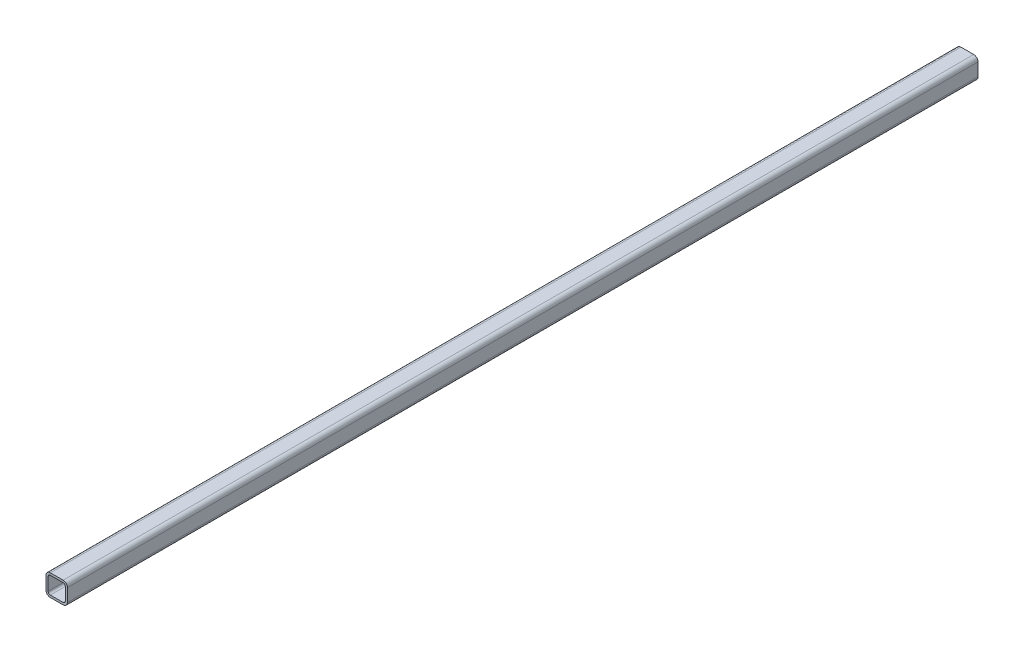
ISO-10303-21;
HEADER;
FILE_DESCRIPTION(('STEP AP214'),'2;1');
FILE_NAME('part.step','',(''),(''),'','','');
FILE_SCHEMA(('AUTOMOTIVE_DESIGN { 1 0 10303 214 1 1 1 1 }'));
ENDSEC;
DATA;
#1=APPLICATION_CONTEXT('core data for automotive mechanical design processes');
#2=APPLICATION_PROTOCOL_DEFINITION('international standard','automotive_design',2000,#1);
#3=PRODUCT_CONTEXT('',#1,'mechanical');
#4=PRODUCT('Part','Part','',(#3));
#5=PRODUCT_RELATED_PRODUCT_CATEGORY('part','',(#4));
#6=PRODUCT_DEFINITION_FORMATION('','',#4);
#7=PRODUCT_DEFINITION_CONTEXT('part definition',#1,'design');
#8=PRODUCT_DEFINITION('design','',#6,#7);
#9=PRODUCT_DEFINITION_SHAPE('','',#8);
#10=(LENGTH_UNIT() NAMED_UNIT(*) SI_UNIT(.MILLI.,.METRE.));
#11=(NAMED_UNIT(*) PLANE_ANGLE_UNIT() SI_UNIT($,.RADIAN.));
#12=(NAMED_UNIT(*) SI_UNIT($,.STERADIAN.) SOLID_ANGLE_UNIT());
#13=UNCERTAINTY_MEASURE_WITH_UNIT(LENGTH_MEASURE(1.E-05),#10,'distance_accuracy_value','');
#14=(GEOMETRIC_REPRESENTATION_CONTEXT(3) GLOBAL_UNCERTAINTY_ASSIGNED_CONTEXT((#13)) GLOBAL_UNIT_ASSIGNED_CONTEXT((#10,
#11,#12)) REPRESENTATION_CONTEXT('',''));
#15=CARTESIAN_POINT('',(0.,0.,0.));
#16=DIRECTION('',(0.,0.,1.));
#17=DIRECTION('',(1.,0.,0.));
#18=AXIS2_PLACEMENT_3D('',#15,#16,#17);
#19=CARTESIAN_POINT('',(11.9999999999998,12.,850.011));
#20=DIRECTION('',(0.,0.,-1.));
#21=DIRECTION('',(-1.,0.,0.));
#22=AXIS2_PLACEMENT_3D('',#19,#20,#21);
#23=CYLINDRICAL_SURFACE('',#22,8.);
#24=CARTESIAN_POINT('',(11.9999999999998,12.,-850.011));
#25=DIRECTION('',(0.,0.,1.));
#26=DIRECTION('',(1.,0.,0.));
#27=AXIS2_PLACEMENT_3D('',#24,#25,#26);
#28=CIRCLE('',#27,8.);
#29=CARTESIAN_POINT('',(19.9999999999998,12.,-850.011));
#30=VERTEX_POINT('',#29);
#31=CARTESIAN_POINT('',(11.9999999999998,20.,-850.011));
#32=VERTEX_POINT('',#31);
#33=EDGE_CURVE('E289',#30,#32,#28,.T.);
#34=ORIENTED_EDGE('',*,*,#33,.T.);
#35=DIRECTION('',(0.,0.,-1.));
#36=VECTOR('',#35,1.);
#37=CARTESIAN_POINT('',(11.9999999999998,20.,850.011));
#38=LINE('',#37,#36);
#39=CARTESIAN_POINT('',(11.9999999999998,20.,850.011));
#40=VERTEX_POINT('',#39);
#41=EDGE_CURVE('E12',#40,#32,#38,.T.);
#42=ORIENTED_EDGE('',*,*,#41,.F.);
#43=CARTESIAN_POINT('',(11.9999999999998,12.,850.011));
#44=DIRECTION('',(0.,0.,1.));
#45=DIRECTION('',(1.,0.,0.));
#46=AXIS2_PLACEMENT_3D('',#43,#44,#45);
#47=CIRCLE('',#46,8.);
#48=CARTESIAN_POINT('',(19.9999999999998,12.,850.011));
#49=VERTEX_POINT('',#48);
#50=EDGE_CURVE('E394',#49,#40,#47,.T.);
#51=ORIENTED_EDGE('',*,*,#50,.F.);
#52=DIRECTION('',(0.,0.,-1.));
#53=VECTOR('',#52,1.);
#54=CARTESIAN_POINT('',(19.9999999999998,12.,850.011));
#55=LINE('',#54,#53);
#56=EDGE_CURVE('E312',#49,#30,#55,.T.);
#57=ORIENTED_EDGE('',*,*,#56,.T.);
#58=EDGE_LOOP('',(#34,#42,#51,#57));
#59=FACE_BOUND('',#58,.T.);
#60=ADVANCED_FACE('F71',(#59),#23,.T.);
#61=CARTESIAN_POINT('',(11.9999999999998,20.,850.011));
#62=DIRECTION('',(0.,-1.,0.));
#63=DIRECTION('',(0.,0.,-1.));
#64=AXIS2_PLACEMENT_3D('',#61,#62,#63);
#65=PLANE('',#64);
#66=DIRECTION('',(-1.,0.,0.));
#67=VECTOR('',#66,1.);
#68=CARTESIAN_POINT('',(11.9999999999998,20.,-850.011));
#69=LINE('',#68,#67);
#70=CARTESIAN_POINT('',(-12.0000000000002,20.,-850.011));
#71=VERTEX_POINT('',#70);
#72=EDGE_CURVE('E293',#32,#71,#69,.T.);
#73=ORIENTED_EDGE('',*,*,#72,.T.);
#74=DIRECTION('',(0.,0.,-1.));
#75=VECTOR('',#74,1.);
#76=CARTESIAN_POINT('',(-12.0000000000002,20.,850.011));
#77=LINE('',#76,#75);
#78=CARTESIAN_POINT('',(-12.0000000000002,20.,850.011));
#79=VERTEX_POINT('',#78);
#80=EDGE_CURVE('E82',#79,#71,#77,.T.);
#81=ORIENTED_EDGE('',*,*,#80,.F.);
#82=DIRECTION('',(-1.,0.,0.));
#83=VECTOR('',#82,1.);
#84=CARTESIAN_POINT('',(11.9999999999998,20.,850.011));
#85=LINE('',#84,#83);
#86=EDGE_CURVE('E397',#40,#79,#85,.T.);
#87=ORIENTED_EDGE('',*,*,#86,.F.);
#88=ORIENTED_EDGE('',*,*,#41,.T.);
#89=EDGE_LOOP('',(#73,#81,#87,#88));
#90=FACE_BOUND('',#89,.T.);
#91=ADVANCED_FACE('F432',(#90),#65,.F.);
#92=CARTESIAN_POINT('',(-12.0000000000002,12.,850.011));
#93=DIRECTION('',(0.,0.,-1.));
#94=DIRECTION('',(-1.,0.,0.));
#95=AXIS2_PLACEMENT_3D('',#92,#93,#94);
#96=CYLINDRICAL_SURFACE('',#95,8.);
#97=CARTESIAN_POINT('',(-12.0000000000002,12.,-850.011));
#98=DIRECTION('',(0.,0.,1.));
#99=DIRECTION('',(1.,0.,0.));
#100=AXIS2_PLACEMENT_3D('',#97,#98,#99);
#101=CIRCLE('',#100,8.);
#102=CARTESIAN_POINT('',(-20.0000000000002,12.,-850.011));
#103=VERTEX_POINT('',#102);
#104=EDGE_CURVE('E296',#71,#103,#101,.T.);
#105=ORIENTED_EDGE('',*,*,#104,.T.);
#106=DIRECTION('',(0.,0.,-1.));
#107=VECTOR('',#106,1.);
#108=CARTESIAN_POINT('',(-20.0000000000002,12.,850.011));
#109=LINE('',#108,#107);
#110=CARTESIAN_POINT('',(-20.0000000000002,12.,850.011));
#111=VERTEX_POINT('',#110);
#112=EDGE_CURVE('E323',#111,#103,#109,.T.);
#113=ORIENTED_EDGE('',*,*,#112,.F.);
#114=CARTESIAN_POINT('',(-12.0000000000002,12.,850.011));
#115=DIRECTION('',(0.,0.,1.));
#116=DIRECTION('',(1.,0.,0.));
#117=AXIS2_PLACEMENT_3D('',#114,#115,#116);
#118=CIRCLE('',#117,8.);
#119=EDGE_CURVE('E400',#79,#111,#118,.T.);
#120=ORIENTED_EDGE('',*,*,#119,.F.);
#121=ORIENTED_EDGE('',*,*,#80,.T.);
#122=EDGE_LOOP('',(#105,#113,#120,#121));
#123=FACE_BOUND('',#122,.T.);
#124=ADVANCED_FACE('F438',(#123),#96,.T.);
#125=CARTESIAN_POINT('',(-20.0000000000002,-12.,850.011));
#126=DIRECTION('',(1.,0.,0.));
#127=DIRECTION('',(0.,0.,-1.));
#128=AXIS2_PLACEMENT_3D('',#125,#126,#127);
#129=PLANE('',#128);
#130=DIRECTION('',(0.,-1.,0.));
#131=VECTOR('',#130,1.);
#132=CARTESIAN_POINT('',(-20.0000000000002,-12.,-850.011));
#133=LINE('',#132,#131);
#134=CARTESIAN_POINT('',(-20.0000000000002,-12.,-850.011));
#135=VERTEX_POINT('',#134);
#136=EDGE_CURVE('E299',#103,#135,#133,.T.);
#137=ORIENTED_EDGE('',*,*,#136,.T.);
#138=DIRECTION('',(0.,0.,-1.));
#139=VECTOR('',#138,1.);
#140=CARTESIAN_POINT('',(-20.0000000000002,-12.,850.011));
#141=LINE('',#140,#139);
#142=CARTESIAN_POINT('',(-20.0000000000002,-12.,850.011));
#143=VERTEX_POINT('',#142);
#144=EDGE_CURVE('E319',#143,#135,#141,.T.);
#145=ORIENTED_EDGE('',*,*,#144,.F.);
#146=DIRECTION('',(0.,-1.,0.));
#147=VECTOR('',#146,1.);
#148=CARTESIAN_POINT('',(-20.0000000000002,-12.,850.011));
#149=LINE('',#148,#147);
#150=EDGE_CURVE('E403',#111,#143,#149,.T.);
#151=ORIENTED_EDGE('',*,*,#150,.F.);
#152=ORIENTED_EDGE('',*,*,#112,.T.);
#153=EDGE_LOOP('',(#137,#145,#151,#152));
#154=FACE_BOUND('',#153,.T.);
#155=ADVANCED_FACE('F587',(#154),#129,.F.);
#156=CARTESIAN_POINT('',(-12.0000000000002,-12.,850.011));
#157=DIRECTION('',(0.,0.,-1.));
#158=DIRECTION('',(-1.,0.,0.));
#159=AXIS2_PLACEMENT_3D('',#156,#157,#158);
#160=CYLINDRICAL_SURFACE('',#159,8.);
#161=CARTESIAN_POINT('',(-12.0000000000002,-12.,-850.011));
#162=DIRECTION('',(0.,0.,1.));
#163=DIRECTION('',(1.,0.,0.));
#164=AXIS2_PLACEMENT_3D('',#161,#162,#163);
#165=CIRCLE('',#164,8.);
#166=CARTESIAN_POINT('',(-12.0000000000002,-20.,-850.011));
#167=VERTEX_POINT('',#166);
#168=EDGE_CURVE('E302',#135,#167,#165,.T.);
#169=ORIENTED_EDGE('',*,*,#168,.T.);
#170=DIRECTION('',(0.,0.,-1.));
#171=VECTOR('',#170,1.);
#172=CARTESIAN_POINT('',(-12.0000000000002,-20.,850.011));
#173=LINE('',#172,#171);
#174=CARTESIAN_POINT('',(-12.0000000000002,-20.,850.011));
#175=VERTEX_POINT('',#174);
#176=EDGE_CURVE('E245',#175,#167,#173,.T.);
#177=ORIENTED_EDGE('',*,*,#176,.F.);
#178=CARTESIAN_POINT('',(-12.0000000000002,-12.,850.011));
#179=DIRECTION('',(0.,0.,1.));
#180=DIRECTION('',(1.,0.,0.));
#181=AXIS2_PLACEMENT_3D('',#178,#179,#180);
#182=CIRCLE('',#181,8.);
#183=EDGE_CURVE('E234',#143,#175,#182,.T.);
#184=ORIENTED_EDGE('',*,*,#183,.F.);
#185=ORIENTED_EDGE('',*,*,#144,.T.);
#186=EDGE_LOOP('',(#169,#177,#184,#185));
#187=FACE_BOUND('',#186,.T.);
#188=ADVANCED_FACE('F575',(#187),#160,.T.);
#189=CARTESIAN_POINT('',(-12.0000000000002,-20.,850.011));
#190=DIRECTION('',(0.,1.,0.));
#191=DIRECTION('',(0.,0.,1.));
#192=AXIS2_PLACEMENT_3D('',#189,#190,#191);
#193=PLANE('',#192);
#194=DIRECTION('',(1.,0.,0.));
#195=VECTOR('',#194,1.);
#196=CARTESIAN_POINT('',(-12.0000000000002,-20.,-850.011));
#197=LINE('',#196,#195);
#198=CARTESIAN_POINT('',(11.9999999999998,-20.,-850.011));
#199=VERTEX_POINT('',#198);
#200=EDGE_CURVE('E243',#167,#199,#197,.T.);
#201=ORIENTED_EDGE('',*,*,#200,.T.);
#202=DIRECTION('',(0.,0.,-1.));
#203=VECTOR('',#202,1.);
#204=CARTESIAN_POINT('',(11.9999999999998,-20.,850.011));
#205=LINE('',#204,#203);
#206=CARTESIAN_POINT('',(11.9999999999998,-20.,850.011));
#207=VERTEX_POINT('',#206);
#208=EDGE_CURVE('E240',#207,#199,#205,.T.);
#209=ORIENTED_EDGE('',*,*,#208,.F.);
#210=DIRECTION('',(1.,0.,0.));
#211=VECTOR('',#210,1.);
#212=CARTESIAN_POINT('',(-12.0000000000002,-20.,850.011));
#213=LINE('',#212,#211);
#214=EDGE_CURVE('E228',#175,#207,#213,.T.);
#215=ORIENTED_EDGE('',*,*,#214,.F.);
#216=ORIENTED_EDGE('',*,*,#176,.T.);
#217=EDGE_LOOP('',(#201,#209,#215,#216));
#218=FACE_BOUND('',#217,.T.);
#219=ADVANCED_FACE('F241',(#218),#193,.F.);
#220=CARTESIAN_POINT('',(11.9999999999998,-12.,850.011));
#221=DIRECTION('',(0.,0.,-1.));
#222=DIRECTION('',(-1.,0.,0.));
#223=AXIS2_PLACEMENT_3D('',#220,#221,#222);
#224=CYLINDRICAL_SURFACE('',#223,8.);
#225=CARTESIAN_POINT('',(11.9999999999998,-12.,-850.011));
#226=DIRECTION('',(0.,0.,1.));
#227=DIRECTION('',(1.,0.,0.));
#228=AXIS2_PLACEMENT_3D('',#225,#226,#227);
#229=CIRCLE('',#228,8.);
#230=CARTESIAN_POINT('',(19.9999999999998,-12.,-850.011));
#231=VERTEX_POINT('',#230);
#232=EDGE_CURVE('E163',#199,#231,#229,.T.);
#233=ORIENTED_EDGE('',*,*,#232,.T.);
#234=DIRECTION('',(0.,0.,-1.));
#235=VECTOR('',#234,1.);
#236=CARTESIAN_POINT('',(19.9999999999998,-12.,850.011));
#237=LINE('',#236,#235);
#238=CARTESIAN_POINT('',(19.9999999999998,-12.,850.011));
#239=VERTEX_POINT('',#238);
#240=EDGE_CURVE('E246',#239,#231,#237,.T.);
#241=ORIENTED_EDGE('',*,*,#240,.F.);
#242=CARTESIAN_POINT('',(11.9999999999998,-12.,850.011));
#243=DIRECTION('',(0.,0.,1.));
#244=DIRECTION('',(1.,0.,0.));
#245=AXIS2_PLACEMENT_3D('',#242,#243,#244);
#246=CIRCLE('',#245,8.);
#247=EDGE_CURVE('E232',#207,#239,#246,.T.);
#248=ORIENTED_EDGE('',*,*,#247,.F.);
#249=ORIENTED_EDGE('',*,*,#208,.T.);
#250=EDGE_LOOP('',(#233,#241,#248,#249));
#251=FACE_BOUND('',#250,.T.);
#252=ADVANCED_FACE('F248',(#251),#224,.T.);
#253=CARTESIAN_POINT('',(-12.0000000000002,12.,850.011));
#254=DIRECTION('',(0.,0.,-1.));
#255=DIRECTION('',(-1.,0.,0.));
#256=AXIS2_PLACEMENT_3D('',#253,#254,#255);
#257=CYLINDRICAL_SURFACE('',#256,4.);
#258=CARTESIAN_POINT('',(-12.0000000000002,12.,-850.011));
#259=DIRECTION('',(0.,0.,1.));
#260=DIRECTION('',(1.,0.,0.));
#261=AXIS2_PLACEMENT_3D('',#258,#259,#260);
#262=CIRCLE('',#261,4.);
#263=CARTESIAN_POINT('',(-12.0000000000002,16.,-850.011));
#264=VERTEX_POINT('',#263);
#265=CARTESIAN_POINT('',(-16.0000000000002,12.,-850.011));
#266=VERTEX_POINT('',#265);
#267=EDGE_CURVE('E257',#264,#266,#262,.T.);
#268=ORIENTED_EDGE('',*,*,#267,.F.);
#269=DIRECTION('',(0.,0.,-1.));
#270=VECTOR('',#269,1.);
#271=CARTESIAN_POINT('',(-12.0000000000002,16.,850.011));
#272=LINE('',#271,#270);
#273=CARTESIAN_POINT('',(-12.0000000000002,16.,850.011));
#274=VERTEX_POINT('',#273);
#275=EDGE_CURVE('E75',#274,#264,#272,.T.);
#276=ORIENTED_EDGE('',*,*,#275,.F.);
#277=CARTESIAN_POINT('',(-12.0000000000002,12.,850.011));
#278=DIRECTION('',(0.,0.,1.));
#279=DIRECTION('',(1.,0.,0.));
#280=AXIS2_PLACEMENT_3D('',#277,#278,#279);
#281=CIRCLE('',#280,4.);
#282=CARTESIAN_POINT('',(-16.0000000000002,12.,850.011));
#283=VERTEX_POINT('',#282);
#284=EDGE_CURVE('E311',#274,#283,#281,.T.);
#285=ORIENTED_EDGE('',*,*,#284,.T.);
#286=DIRECTION('',(0.,0.,-1.));
#287=VECTOR('',#286,1.);
#288=CARTESIAN_POINT('',(-16.0000000000002,12.,850.011));
#289=LINE('',#288,#287);
#290=EDGE_CURVE('E253',#283,#266,#289,.T.);
#291=ORIENTED_EDGE('',*,*,#290,.T.);
#292=EDGE_LOOP('',(#268,#276,#285,#291));
#293=FACE_BOUND('',#292,.T.);
#294=ADVANCED_FACE('F73',(#293),#257,.F.);
#295=CARTESIAN_POINT('',(11.9999999999998,16.,850.011));
#296=DIRECTION('',(0.,-1.,0.));
#297=DIRECTION('',(0.,0.,-1.));
#298=AXIS2_PLACEMENT_3D('',#295,#296,#297);
#299=PLANE('',#298);
#300=DIRECTION('',(-1.,0.,0.));
#301=VECTOR('',#300,1.);
#302=CARTESIAN_POINT('',(11.9999999999998,16.,-850.011));
#303=LINE('',#302,#301);
#304=CARTESIAN_POINT('',(11.9999999999998,16.,-850.011));
#305=VERTEX_POINT('',#304);
#306=EDGE_CURVE('E261',#305,#264,#303,.T.);
#307=ORIENTED_EDGE('',*,*,#306,.F.);
#308=DIRECTION('',(0.,0.,-1.));
#309=VECTOR('',#308,1.);
#310=CARTESIAN_POINT('',(11.9999999999998,16.,850.011));
#311=LINE('',#310,#309);
#312=CARTESIAN_POINT('',(11.9999999999998,16.,850.011));
#313=VERTEX_POINT('',#312);
#314=EDGE_CURVE('E346',#313,#305,#311,.T.);
#315=ORIENTED_EDGE('',*,*,#314,.F.);
#316=DIRECTION('',(-1.,0.,0.));
#317=VECTOR('',#316,1.);
#318=CARTESIAN_POINT('',(11.9999999999998,16.,850.011));
#319=LINE('',#318,#317);
#320=EDGE_CURVE('E357',#313,#274,#319,.T.);
#321=ORIENTED_EDGE('',*,*,#320,.T.);
#322=ORIENTED_EDGE('',*,*,#275,.T.);
#323=EDGE_LOOP('',(#307,#315,#321,#322));
#324=FACE_BOUND('',#323,.T.);
#325=ADVANCED_FACE('F355',(#324),#299,.T.);
#326=CARTESIAN_POINT('',(11.9999999999998,12.,850.011));
#327=DIRECTION('',(0.,0.,-1.));
#328=DIRECTION('',(-1.,0.,0.));
#329=AXIS2_PLACEMENT_3D('',#326,#327,#328);
#330=CYLINDRICAL_SURFACE('',#329,4.);
#331=CARTESIAN_POINT('',(11.9999999999998,12.,-850.011));
#332=DIRECTION('',(0.,0.,1.));
#333=DIRECTION('',(1.,0.,0.));
#334=AXIS2_PLACEMENT_3D('',#331,#332,#333);
#335=CIRCLE('',#334,4.);
#336=CARTESIAN_POINT('',(15.9999999999998,12.,-850.011));
#337=VERTEX_POINT('',#336);
#338=EDGE_CURVE('E265',#337,#305,#335,.T.);
#339=ORIENTED_EDGE('',*,*,#338,.F.);
#340=DIRECTION('',(0.,0.,-1.));
#341=VECTOR('',#340,1.);
#342=CARTESIAN_POINT('',(15.9999999999998,12.,850.011));
#343=LINE('',#342,#341);
#344=CARTESIAN_POINT('',(15.9999999999998,12.,850.011));
#345=VERTEX_POINT('',#344);
#346=EDGE_CURVE('E344',#345,#337,#343,.T.);
#347=ORIENTED_EDGE('',*,*,#346,.F.);
#348=CARTESIAN_POINT('',(11.9999999999998,12.,850.011));
#349=DIRECTION('',(0.,0.,1.));
#350=DIRECTION('',(1.,0.,0.));
#351=AXIS2_PLACEMENT_3D('',#348,#349,#350);
#352=CIRCLE('',#351,4.);
#353=EDGE_CURVE('E365',#345,#313,#352,.T.);
#354=ORIENTED_EDGE('',*,*,#353,.T.);
#355=ORIENTED_EDGE('',*,*,#314,.T.);
#356=EDGE_LOOP('',(#339,#347,#354,#355));
#357=FACE_BOUND('',#356,.T.);
#358=ADVANCED_FACE('F363',(#357),#330,.F.);
#359=CARTESIAN_POINT('',(15.9999999999998,12.,850.011));
#360=DIRECTION('',(-1.,0.,0.));
#361=DIRECTION('',(0.,0.,1.));
#362=AXIS2_PLACEMENT_3D('',#359,#360,#361);
#363=PLANE('',#362);
#364=DIRECTION('',(0.,1.,0.));
#365=VECTOR('',#364,1.);
#366=CARTESIAN_POINT('',(15.9999999999998,12.,-850.011));
#367=LINE('',#366,#365);
#368=CARTESIAN_POINT('',(15.9999999999998,-12.,-850.011));
#369=VERTEX_POINT('',#368);
#370=EDGE_CURVE('E269',#369,#337,#367,.T.);
#371=ORIENTED_EDGE('',*,*,#370,.F.);
#372=DIRECTION('',(0.,0.,-1.));
#373=VECTOR('',#372,1.);
#374=CARTESIAN_POINT('',(15.9999999999998,-12.,850.011));
#375=LINE('',#374,#373);
#376=CARTESIAN_POINT('',(15.9999999999998,-12.,850.011));
#377=VERTEX_POINT('',#376);
#378=EDGE_CURVE('E341',#377,#369,#375,.T.);
#379=ORIENTED_EDGE('',*,*,#378,.F.);
#380=DIRECTION('',(0.,1.,0.));
#381=VECTOR('',#380,1.);
#382=CARTESIAN_POINT('',(15.9999999999998,12.,850.011));
#383=LINE('',#382,#381);
#384=EDGE_CURVE('E371',#377,#345,#383,.T.);
#385=ORIENTED_EDGE('',*,*,#384,.T.);
#386=ORIENTED_EDGE('',*,*,#346,.T.);
#387=EDGE_LOOP('',(#371,#379,#385,#386));
#388=FACE_BOUND('',#387,.T.);
#389=ADVANCED_FACE('F375',(#388),#363,.T.);
#390=CARTESIAN_POINT('',(11.9999999999998,-12.,850.011));
#391=DIRECTION('',(0.,0.,-1.));
#392=DIRECTION('',(-1.,0.,0.));
#393=AXIS2_PLACEMENT_3D('',#390,#391,#392);
#394=CYLINDRICAL_SURFACE('',#393,3.99999999999999);
#395=CARTESIAN_POINT('',(11.9999999999998,-12.,-850.011));
#396=DIRECTION('',(0.,0.,1.));
#397=DIRECTION('',(1.,0.,0.));
#398=AXIS2_PLACEMENT_3D('',#395,#396,#397);
#399=CIRCLE('',#398,3.99999999999999);
#400=CARTESIAN_POINT('',(11.9999999999998,-16.,-850.011));
#401=VERTEX_POINT('',#400);
#402=EDGE_CURVE('E273',#401,#369,#399,.T.);
#403=ORIENTED_EDGE('',*,*,#402,.F.);
#404=DIRECTION('',(0.,0.,-1.));
#405=VECTOR('',#404,1.);
#406=CARTESIAN_POINT('',(11.9999999999998,-16.,850.011));
#407=LINE('',#406,#405);
#408=CARTESIAN_POINT('',(11.9999999999998,-16.,850.011));
#409=VERTEX_POINT('',#408);
#410=EDGE_CURVE('E338',#409,#401,#407,.T.);
#411=ORIENTED_EDGE('',*,*,#410,.F.);
#412=CARTESIAN_POINT('',(11.9999999999998,-12.,850.011));
#413=DIRECTION('',(0.,0.,1.));
#414=DIRECTION('',(1.,0.,0.));
#415=AXIS2_PLACEMENT_3D('',#412,#413,#414);
#416=CIRCLE('',#415,3.99999999999999);
#417=EDGE_CURVE('E377',#409,#377,#416,.T.);
#418=ORIENTED_EDGE('',*,*,#417,.T.);
#419=ORIENTED_EDGE('',*,*,#378,.T.);
#420=EDGE_LOOP('',(#403,#411,#418,#419));
#421=FACE_BOUND('',#420,.T.);
#422=ADVANCED_FACE('F422',(#421),#394,.F.);
#423=CARTESIAN_POINT('',(-12.0000000000002,-16.,850.011));
#424=DIRECTION('',(0.,1.,0.));
#425=DIRECTION('',(0.,0.,1.));
#426=AXIS2_PLACEMENT_3D('',#423,#424,#425);
#427=PLANE('',#426);
#428=DIRECTION('',(1.,0.,0.));
#429=VECTOR('',#428,1.);
#430=CARTESIAN_POINT('',(-12.0000000000002,-16.,-850.011));
#431=LINE('',#430,#429);
#432=CARTESIAN_POINT('',(-12.0000000000002,-16.,-850.011));
#433=VERTEX_POINT('',#432);
#434=EDGE_CURVE('E277',#433,#401,#431,.T.);
#435=ORIENTED_EDGE('',*,*,#434,.F.);
#436=DIRECTION('',(0.,0.,-1.));
#437=VECTOR('',#436,1.);
#438=CARTESIAN_POINT('',(-12.0000000000002,-16.,850.011));
#439=LINE('',#438,#437);
#440=CARTESIAN_POINT('',(-12.0000000000002,-16.,850.011));
#441=VERTEX_POINT('',#440);
#442=EDGE_CURVE('E335',#441,#433,#439,.T.);
#443=ORIENTED_EDGE('',*,*,#442,.F.);
#444=DIRECTION('',(1.,0.,0.));
#445=VECTOR('',#444,1.);
#446=CARTESIAN_POINT('',(-12.0000000000002,-16.,850.011));
#447=LINE('',#446,#445);
#448=EDGE_CURVE('E380',#441,#409,#447,.T.);
#449=ORIENTED_EDGE('',*,*,#448,.T.);
#450=ORIENTED_EDGE('',*,*,#410,.T.);
#451=EDGE_LOOP('',(#435,#443,#449,#450));
#452=FACE_BOUND('',#451,.T.);
#453=ADVANCED_FACE('F419',(#452),#427,.T.);
#454=CARTESIAN_POINT('',(-12.0000000000002,-12.,850.011));
#455=DIRECTION('',(0.,0.,-1.));
#456=DIRECTION('',(-1.,0.,0.));
#457=AXIS2_PLACEMENT_3D('',#454,#455,#456);
#458=CYLINDRICAL_SURFACE('',#457,4.);
#459=CARTESIAN_POINT('',(-12.0000000000002,-12.,-850.011));
#460=DIRECTION('',(0.,0.,1.));
#461=DIRECTION('',(1.,0.,0.));
#462=AXIS2_PLACEMENT_3D('',#459,#460,#461);
#463=CIRCLE('',#462,4.);
#464=CARTESIAN_POINT('',(-16.0000000000002,-12.,-850.011));
#465=VERTEX_POINT('',#464);
#466=EDGE_CURVE('E281',#465,#433,#463,.T.);
#467=ORIENTED_EDGE('',*,*,#466,.F.);
#468=DIRECTION('',(0.,0.,-1.));
#469=VECTOR('',#468,1.);
#470=CARTESIAN_POINT('',(-16.0000000000002,-12.,850.011));
#471=LINE('',#470,#469);
#472=CARTESIAN_POINT('',(-16.0000000000002,-12.,850.011));
#473=VERTEX_POINT('',#472);
#474=EDGE_CURVE('E332',#473,#465,#471,.T.);
#475=ORIENTED_EDGE('',*,*,#474,.F.);
#476=CARTESIAN_POINT('',(-12.0000000000002,-12.,850.011));
#477=DIRECTION('',(0.,0.,1.));
#478=DIRECTION('',(1.,0.,0.));
#479=AXIS2_PLACEMENT_3D('',#476,#477,#478);
#480=CIRCLE('',#479,4.);
#481=EDGE_CURVE('E386',#473,#441,#480,.T.);
#482=ORIENTED_EDGE('',*,*,#481,.T.);
#483=ORIENTED_EDGE('',*,*,#442,.T.);
#484=EDGE_LOOP('',(#467,#475,#482,#483));
#485=FACE_BOUND('',#484,.T.);
#486=ADVANCED_FACE('F417',(#485),#458,.F.);
#487=CARTESIAN_POINT('',(-16.0000000000002,-12.,850.011));
#488=DIRECTION('',(1.,0.,0.));
#489=DIRECTION('',(0.,0.,-1.));
#490=AXIS2_PLACEMENT_3D('',#487,#488,#489);
#491=PLANE('',#490);
#492=DIRECTION('',(0.,-1.,0.));
#493=VECTOR('',#492,1.);
#494=CARTESIAN_POINT('',(-16.0000000000002,-12.,-850.011));
#495=LINE('',#494,#493);
#496=EDGE_CURVE('E285',#266,#465,#495,.T.);
#497=ORIENTED_EDGE('',*,*,#496,.F.);
#498=ORIENTED_EDGE('',*,*,#290,.F.);
#499=DIRECTION('',(0.,-1.,0.));
#500=VECTOR('',#499,1.);
#501=CARTESIAN_POINT('',(-16.0000000000002,-12.,850.011));
#502=LINE('',#501,#500);
#503=EDGE_CURVE('E390',#283,#473,#502,.T.);
#504=ORIENTED_EDGE('',*,*,#503,.T.);
#505=ORIENTED_EDGE('',*,*,#474,.T.);
#506=EDGE_LOOP('',(#497,#498,#504,#505));
#507=FACE_BOUND('',#506,.T.);
#508=ADVANCED_FACE('F413',(#507),#491,.T.);
#509=CARTESIAN_POINT('',(19.9999999999998,12.,850.011));
#510=DIRECTION('',(-1.,0.,0.));
#511=DIRECTION('',(0.,0.,1.));
#512=AXIS2_PLACEMENT_3D('',#509,#510,#511);
#513=PLANE('',#512);
#514=DIRECTION('',(0.,1.,0.));
#515=VECTOR('',#514,1.);
#516=CARTESIAN_POINT('',(19.9999999999998,12.,-850.011));
#517=LINE('',#516,#515);
#518=EDGE_CURVE('E170',#231,#30,#517,.T.);
#519=ORIENTED_EDGE('',*,*,#518,.T.);
#520=ORIENTED_EDGE('',*,*,#56,.F.);
#521=DIRECTION('',(0.,1.,0.));
#522=VECTOR('',#521,1.);
#523=CARTESIAN_POINT('',(19.9999999999998,12.,850.011));
#524=LINE('',#523,#522);
#525=EDGE_CURVE('E94',#239,#49,#524,.T.);
#526=ORIENTED_EDGE('',*,*,#525,.F.);
#527=ORIENTED_EDGE('',*,*,#240,.T.);
#528=EDGE_LOOP('',(#519,#520,#526,#527));
#529=FACE_BOUND('',#528,.T.);
#530=ADVANCED_FACE('F445',(#529),#513,.F.);
#531=CARTESIAN_POINT('',(11.9999999999998,12.,850.011));
#532=DIRECTION('',(0.,0.,1.));
#533=DIRECTION('',(1.,0.,0.));
#534=AXIS2_PLACEMENT_3D('',#531,#532,#533);
#535=PLANE('',#534);
#536=ORIENTED_EDGE('',*,*,#284,.F.);
#537=ORIENTED_EDGE('',*,*,#320,.F.);
#538=ORIENTED_EDGE('',*,*,#353,.F.);
#539=ORIENTED_EDGE('',*,*,#384,.F.);
#540=ORIENTED_EDGE('',*,*,#417,.F.);
#541=ORIENTED_EDGE('',*,*,#448,.F.);
#542=ORIENTED_EDGE('',*,*,#481,.F.);
#543=ORIENTED_EDGE('',*,*,#503,.F.);
#544=EDGE_LOOP('',(#536,#537,#538,#539,#540,#541,#542,#543));
#545=FACE_BOUND('',#544,.T.);
#546=ORIENTED_EDGE('',*,*,#50,.T.);
#547=ORIENTED_EDGE('',*,*,#86,.T.);
#548=ORIENTED_EDGE('',*,*,#119,.T.);
#549=ORIENTED_EDGE('',*,*,#150,.T.);
#550=ORIENTED_EDGE('',*,*,#183,.T.);
#551=ORIENTED_EDGE('',*,*,#214,.T.);
#552=ORIENTED_EDGE('',*,*,#247,.T.);
#553=ORIENTED_EDGE('',*,*,#525,.T.);
#554=EDGE_LOOP('',(#546,#547,#548,#549,#550,#551,#552,#553));
#555=FACE_BOUND('',#554,.T.);
#556=ADVANCED_FACE('F230',(#545,#555),#535,.T.);
#557=CARTESIAN_POINT('',(11.9999999999998,12.,-850.011));
#558=DIRECTION('',(0.,0.,1.));
#559=DIRECTION('',(1.,0.,0.));
#560=AXIS2_PLACEMENT_3D('',#557,#558,#559);
#561=PLANE('',#560);
#562=ORIENTED_EDGE('',*,*,#267,.T.);
#563=ORIENTED_EDGE('',*,*,#496,.T.);
#564=ORIENTED_EDGE('',*,*,#466,.T.);
#565=ORIENTED_EDGE('',*,*,#434,.T.);
#566=ORIENTED_EDGE('',*,*,#402,.T.);
#567=ORIENTED_EDGE('',*,*,#370,.T.);
#568=ORIENTED_EDGE('',*,*,#338,.T.);
#569=ORIENTED_EDGE('',*,*,#306,.T.);
#570=EDGE_LOOP('',(#562,#563,#564,#565,#566,#567,#568,#569));
#571=FACE_BOUND('',#570,.T.);
#572=ORIENTED_EDGE('',*,*,#33,.F.);
#573=ORIENTED_EDGE('',*,*,#518,.F.);
#574=ORIENTED_EDGE('',*,*,#232,.F.);
#575=ORIENTED_EDGE('',*,*,#200,.F.);
#576=ORIENTED_EDGE('',*,*,#168,.F.);
#577=ORIENTED_EDGE('',*,*,#136,.F.);
#578=ORIENTED_EDGE('',*,*,#104,.F.);
#579=ORIENTED_EDGE('',*,*,#72,.F.);
#580=EDGE_LOOP('',(#572,#573,#574,#575,#576,#577,#578,#579));
#581=FACE_BOUND('',#580,.T.);
#582=ADVANCED_FACE('F360',(#571,#581),#561,.F.);
#583=CLOSED_SHELL('',(#60,#91,#124,#155,#188,#219,#252,#294,#325,#358,#389,#422,#453,#486,#508,
#530,#556,#582));
#584=MANIFOLD_SOLID_BREP('B2',#583);
#585=ADVANCED_BREP_SHAPE_REPRESENTATION('',(#18,#584),#14);
#586=SHAPE_DEFINITION_REPRESENTATION(#9,#585);
ENDSEC;
END-ISO-10303-21;
